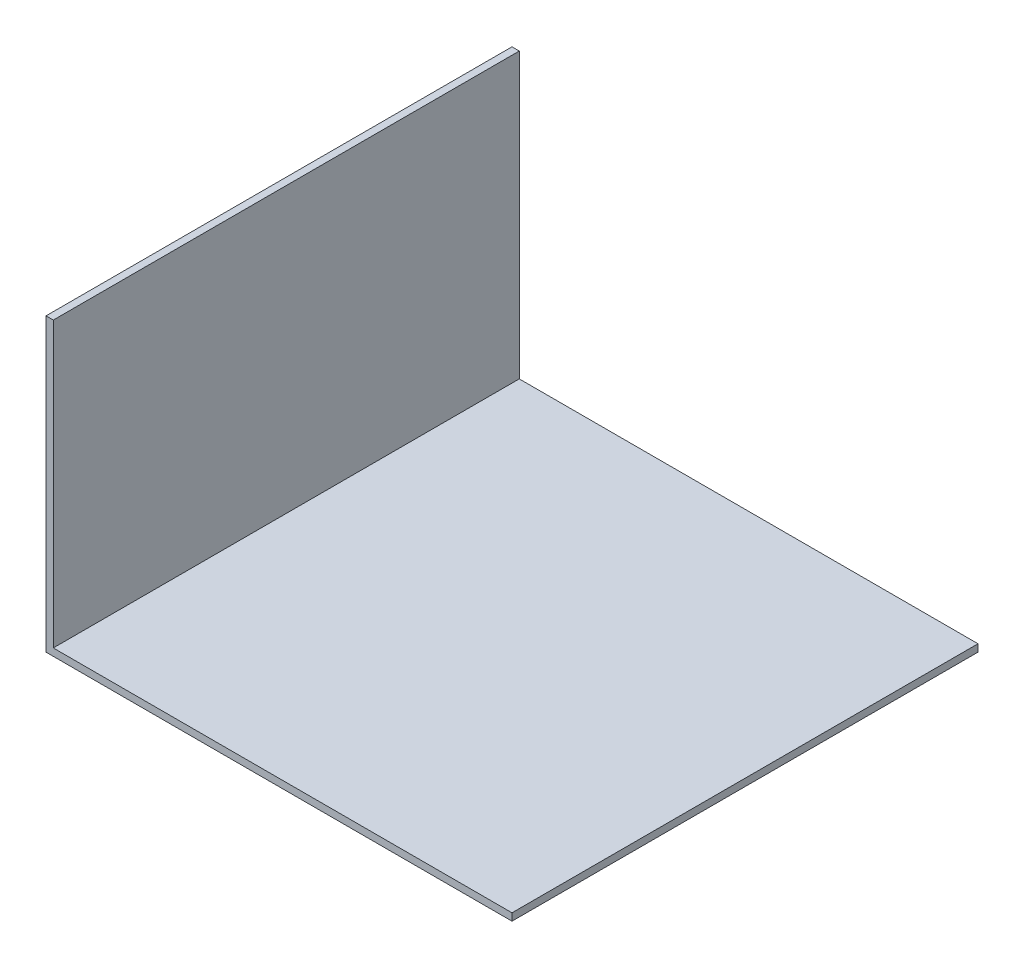
ISO-10303-21;
HEADER;
FILE_DESCRIPTION(('STEP AP214'),'2;1');
FILE_NAME('part.step','',(''),(''),'','','');
FILE_SCHEMA(('AUTOMOTIVE_DESIGN { 1 0 10303 214 1 1 1 1 }'));
ENDSEC;
DATA;
#1=APPLICATION_CONTEXT('core data for automotive mechanical design processes');
#2=APPLICATION_PROTOCOL_DEFINITION('international standard','automotive_design',2000,#1);
#3=PRODUCT_CONTEXT('',#1,'mechanical');
#4=PRODUCT('Part','Part','',(#3));
#5=PRODUCT_RELATED_PRODUCT_CATEGORY('part','',(#4));
#6=PRODUCT_DEFINITION_FORMATION('','',#4);
#7=PRODUCT_DEFINITION_CONTEXT('part definition',#1,'design');
#8=PRODUCT_DEFINITION('design','',#6,#7);
#9=PRODUCT_DEFINITION_SHAPE('','',#8);
#10=(LENGTH_UNIT() NAMED_UNIT(*) SI_UNIT(.MILLI.,.METRE.));
#11=(NAMED_UNIT(*) PLANE_ANGLE_UNIT() SI_UNIT($,.RADIAN.));
#12=(NAMED_UNIT(*) SI_UNIT($,.STERADIAN.) SOLID_ANGLE_UNIT());
#13=UNCERTAINTY_MEASURE_WITH_UNIT(LENGTH_MEASURE(1.E-05),#10,'distance_accuracy_value','');
#14=(GEOMETRIC_REPRESENTATION_CONTEXT(3) GLOBAL_UNCERTAINTY_ASSIGNED_CONTEXT((#13)) GLOBAL_UNIT_ASSIGNED_CONTEXT((#10,
#11,#12)) REPRESENTATION_CONTEXT('',''));
#15=CARTESIAN_POINT('',(0.,0.,0.));
#16=DIRECTION('',(0.,0.,1.));
#17=DIRECTION('',(1.,0.,0.));
#18=AXIS2_PLACEMENT_3D('',#15,#16,#17);
#19=CARTESIAN_POINT('',(24.2882514848805,0.,203.2));
#20=DIRECTION('',(1.,0.,0.));
#21=DIRECTION('',(0.,1.,0.));
#22=AXIS2_PLACEMENT_3D('',#19,#20,#21);
#23=PLANE('',#22);
#24=DIRECTION('',(0.,-1.,0.));
#25=VECTOR('',#24,1.);
#26=CARTESIAN_POINT('',(24.2882514848805,0.,0.));
#27=LINE('',#26,#25);
#28=CARTESIAN_POINT('',(24.2882514848805,148.785646972656,0.));
#29=VERTEX_POINT('',#28);
#30=CARTESIAN_POINT('',(24.2882514848805,24.9606469726562,0.));
#31=VERTEX_POINT('',#30);
#32=EDGE_CURVE('E115',#29,#31,#27,.T.);
#33=ORIENTED_EDGE('',*,*,#32,.F.);
#34=DIRECTION('',(0.,0.,-1.));
#35=VECTOR('',#34,1.);
#36=CARTESIAN_POINT('',(24.2882514848805,148.785646972656,203.2));
#37=LINE('',#36,#35);
#38=CARTESIAN_POINT('',(24.2882514848805,148.785646972656,203.2));
#39=VERTEX_POINT('',#38);
#40=EDGE_CURVE('E11',#39,#29,#37,.T.);
#41=ORIENTED_EDGE('',*,*,#40,.F.);
#42=DIRECTION('',(0.,-1.,0.));
#43=VECTOR('',#42,1.);
#44=CARTESIAN_POINT('',(24.2882514848805,0.,203.2));
#45=LINE('',#44,#43);
#46=CARTESIAN_POINT('',(24.2882514848805,24.9606469726562,203.2));
#47=VERTEX_POINT('',#46);
#48=EDGE_CURVE('E128',#39,#47,#45,.T.);
#49=ORIENTED_EDGE('',*,*,#48,.T.);
#50=DIRECTION('',(0.,0.,-1.));
#51=VECTOR('',#50,1.);
#52=CARTESIAN_POINT('',(24.2882514848805,24.9606469726562,203.2));
#53=LINE('',#52,#51);
#54=EDGE_CURVE('E80',#47,#31,#53,.T.);
#55=ORIENTED_EDGE('',*,*,#54,.T.);
#56=EDGE_LOOP('',(#33,#41,#49,#55));
#57=FACE_BOUND('',#56,.T.);
#58=ADVANCED_FACE('F35',(#57),#23,.T.);
#59=CARTESIAN_POINT('',(0.,148.785646972656,203.2));
#60=DIRECTION('',(0.,1.,0.));
#61=DIRECTION('',(0.,0.,1.));
#62=AXIS2_PLACEMENT_3D('',#59,#60,#61);
#63=PLANE('',#62);
#64=DIRECTION('',(1.,0.,0.));
#65=VECTOR('',#64,1.);
#66=CARTESIAN_POINT('',(0.,148.785646972656,0.));
#67=LINE('',#66,#65);
#68=CARTESIAN_POINT('',(21.1132514848805,148.785646972656,0.));
#69=VERTEX_POINT('',#68);
#70=EDGE_CURVE('E118',#69,#29,#67,.T.);
#71=ORIENTED_EDGE('',*,*,#70,.F.);
#72=DIRECTION('',(0.,0.,-1.));
#73=VECTOR('',#72,1.);
#74=CARTESIAN_POINT('',(21.1132514848805,148.785646972656,203.2));
#75=LINE('',#74,#73);
#76=CARTESIAN_POINT('',(21.1132514848805,148.785646972656,203.2));
#77=VERTEX_POINT('',#76);
#78=EDGE_CURVE('E43',#77,#69,#75,.T.);
#79=ORIENTED_EDGE('',*,*,#78,.F.);
#80=DIRECTION('',(1.,0.,0.));
#81=VECTOR('',#80,1.);
#82=CARTESIAN_POINT('',(0.,148.785646972656,203.2));
#83=LINE('',#82,#81);
#84=EDGE_CURVE('E143',#77,#39,#83,.T.);
#85=ORIENTED_EDGE('',*,*,#84,.T.);
#86=ORIENTED_EDGE('',*,*,#40,.T.);
#87=EDGE_LOOP('',(#71,#79,#85,#86));
#88=FACE_BOUND('',#87,.T.);
#89=ADVANCED_FACE('F137',(#88),#63,.T.);
#90=CARTESIAN_POINT('',(21.1132514848805,0.,203.2));
#91=DIRECTION('',(-1.,0.,0.));
#92=DIRECTION('',(0.,0.,1.));
#93=AXIS2_PLACEMENT_3D('',#90,#91,#92);
#94=PLANE('',#93);
#95=DIRECTION('',(0.,1.,0.));
#96=VECTOR('',#95,1.);
#97=CARTESIAN_POINT('',(21.1132514848805,0.,0.));
#98=LINE('',#97,#96);
#99=CARTESIAN_POINT('',(21.1132514848805,21.7856469726562,0.));
#100=VERTEX_POINT('',#99);
#101=EDGE_CURVE('E121',#100,#69,#98,.T.);
#102=ORIENTED_EDGE('',*,*,#101,.F.);
#103=DIRECTION('',(0.,0.,-1.));
#104=VECTOR('',#103,1.);
#105=CARTESIAN_POINT('',(21.1132514848805,21.7856469726562,203.2));
#106=LINE('',#105,#104);
#107=CARTESIAN_POINT('',(21.1132514848805,21.7856469726562,203.2));
#108=VERTEX_POINT('',#107);
#109=EDGE_CURVE('E107',#108,#100,#106,.T.);
#110=ORIENTED_EDGE('',*,*,#109,.F.);
#111=DIRECTION('',(0.,1.,0.));
#112=VECTOR('',#111,1.);
#113=CARTESIAN_POINT('',(21.1132514848805,0.,203.2));
#114=LINE('',#113,#112);
#115=EDGE_CURVE('E100',#108,#77,#114,.T.);
#116=ORIENTED_EDGE('',*,*,#115,.T.);
#117=ORIENTED_EDGE('',*,*,#78,.T.);
#118=EDGE_LOOP('',(#102,#110,#116,#117));
#119=FACE_BOUND('',#118,.T.);
#120=ADVANCED_FACE('F134',(#119),#94,.T.);
#121=CARTESIAN_POINT('',(0.,21.7856469726562,203.2));
#122=DIRECTION('',(0.,1.,0.));
#123=DIRECTION('',(0.,0.,1.));
#124=AXIS2_PLACEMENT_3D('',#121,#122,#123);
#125=PLANE('',#124);
#126=DIRECTION('',(1.,0.,0.));
#127=VECTOR('',#126,1.);
#128=CARTESIAN_POINT('',(0.,21.7856469726562,0.));
#129=LINE('',#128,#127);
#130=CARTESIAN_POINT('',(224.313251484881,21.7856469726562,0.));
#131=VERTEX_POINT('',#130);
#132=EDGE_CURVE('E106',#100,#131,#129,.T.);
#133=ORIENTED_EDGE('',*,*,#132,.T.);
#134=DIRECTION('',(0.,0.,-1.));
#135=VECTOR('',#134,1.);
#136=CARTESIAN_POINT('',(224.313251484881,21.7856469726562,203.2));
#137=LINE('',#136,#135);
#138=CARTESIAN_POINT('',(224.313251484881,21.7856469726562,203.2));
#139=VERTEX_POINT('',#138);
#140=EDGE_CURVE('E103',#139,#131,#137,.T.);
#141=ORIENTED_EDGE('',*,*,#140,.F.);
#142=DIRECTION('',(1.,0.,0.));
#143=VECTOR('',#142,1.);
#144=CARTESIAN_POINT('',(0.,21.7856469726562,203.2));
#145=LINE('',#144,#143);
#146=EDGE_CURVE('E93',#108,#139,#145,.T.);
#147=ORIENTED_EDGE('',*,*,#146,.F.);
#148=ORIENTED_EDGE('',*,*,#109,.T.);
#149=EDGE_LOOP('',(#133,#141,#147,#148));
#150=FACE_BOUND('',#149,.T.);
#151=ADVANCED_FACE('F104',(#150),#125,.F.);
#152=CARTESIAN_POINT('',(224.313251484881,0.,203.2));
#153=DIRECTION('',(-1.,0.,0.));
#154=DIRECTION('',(0.,-1.,0.));
#155=AXIS2_PLACEMENT_3D('',#152,#153,#154);
#156=PLANE('',#155);
#157=DIRECTION('',(0.,1.,0.));
#158=VECTOR('',#157,1.);
#159=CARTESIAN_POINT('',(224.313251484881,0.,0.));
#160=LINE('',#159,#158);
#161=CARTESIAN_POINT('',(224.313251484881,24.9606469726563,0.));
#162=VERTEX_POINT('',#161);
#163=EDGE_CURVE('E73',#131,#162,#160,.T.);
#164=ORIENTED_EDGE('',*,*,#163,.T.);
#165=DIRECTION('',(0.,0.,-1.));
#166=VECTOR('',#165,1.);
#167=CARTESIAN_POINT('',(224.313251484881,24.9606469726563,203.2));
#168=LINE('',#167,#166);
#169=CARTESIAN_POINT('',(224.313251484881,24.9606469726563,203.2));
#170=VERTEX_POINT('',#169);
#171=EDGE_CURVE('E108',#170,#162,#168,.T.);
#172=ORIENTED_EDGE('',*,*,#171,.F.);
#173=DIRECTION('',(0.,1.,0.));
#174=VECTOR('',#173,1.);
#175=CARTESIAN_POINT('',(224.313251484881,0.,203.2));
#176=LINE('',#175,#174);
#177=EDGE_CURVE('E97',#139,#170,#176,.T.);
#178=ORIENTED_EDGE('',*,*,#177,.F.);
#179=ORIENTED_EDGE('',*,*,#140,.T.);
#180=EDGE_LOOP('',(#164,#172,#178,#179));
#181=FACE_BOUND('',#180,.T.);
#182=ADVANCED_FACE('F110',(#181),#156,.F.);
#183=CARTESIAN_POINT('',(0.,24.9606469726562,203.2));
#184=DIRECTION('',(0.,-1.,0.));
#185=DIRECTION('',(1.,0.,0.));
#186=AXIS2_PLACEMENT_3D('',#183,#184,#185);
#187=PLANE('',#186);
#188=DIRECTION('',(-1.,0.,0.));
#189=VECTOR('',#188,1.);
#190=CARTESIAN_POINT('',(0.,24.9606469726562,0.));
#191=LINE('',#190,#189);
#192=EDGE_CURVE('E126',#162,#31,#191,.T.);
#193=ORIENTED_EDGE('',*,*,#192,.T.);
#194=ORIENTED_EDGE('',*,*,#54,.F.);
#195=DIRECTION('',(-1.,0.,0.));
#196=VECTOR('',#195,1.);
#197=CARTESIAN_POINT('',(0.,24.9606469726562,203.2));
#198=LINE('',#197,#196);
#199=EDGE_CURVE('E51',#170,#47,#198,.T.);
#200=ORIENTED_EDGE('',*,*,#199,.F.);
#201=ORIENTED_EDGE('',*,*,#171,.T.);
#202=EDGE_LOOP('',(#193,#194,#200,#201));
#203=FACE_BOUND('',#202,.T.);
#204=ADVANCED_FACE('F142',(#203),#187,.F.);
#205=CARTESIAN_POINT('',(0.,0.,203.2));
#206=DIRECTION('',(0.,0.,1.));
#207=DIRECTION('',(1.,0.,0.));
#208=AXIS2_PLACEMENT_3D('',#205,#206,#207);
#209=PLANE('',#208);
#210=ORIENTED_EDGE('',*,*,#48,.F.);
#211=ORIENTED_EDGE('',*,*,#84,.F.);
#212=ORIENTED_EDGE('',*,*,#115,.F.);
#213=ORIENTED_EDGE('',*,*,#146,.T.);
#214=ORIENTED_EDGE('',*,*,#177,.T.);
#215=ORIENTED_EDGE('',*,*,#199,.T.);
#216=EDGE_LOOP('',(#210,#211,#212,#213,#214,#215));
#217=FACE_BOUND('',#216,.T.);
#218=ADVANCED_FACE('F95',(#217),#209,.T.);
#219=CARTESIAN_POINT('',(0.,0.,0.));
#220=DIRECTION('',(0.,0.,1.));
#221=DIRECTION('',(1.,0.,0.));
#222=AXIS2_PLACEMENT_3D('',#219,#220,#221);
#223=PLANE('',#222);
#224=ORIENTED_EDGE('',*,*,#32,.T.);
#225=ORIENTED_EDGE('',*,*,#192,.F.);
#226=ORIENTED_EDGE('',*,*,#163,.F.);
#227=ORIENTED_EDGE('',*,*,#132,.F.);
#228=ORIENTED_EDGE('',*,*,#101,.T.);
#229=ORIENTED_EDGE('',*,*,#70,.T.);
#230=EDGE_LOOP('',(#224,#225,#226,#227,#228,#229));
#231=FACE_BOUND('',#230,.T.);
#232=ADVANCED_FACE('F139',(#231),#223,.F.);
#233=CLOSED_SHELL('',(#58,#89,#120,#151,#182,#204,#218,#232));
#234=MANIFOLD_SOLID_BREP('B2',#233);
#235=ADVANCED_BREP_SHAPE_REPRESENTATION('',(#18,#234),#14);
#236=SHAPE_DEFINITION_REPRESENTATION(#9,#235);
ENDSEC;
END-ISO-10303-21;
